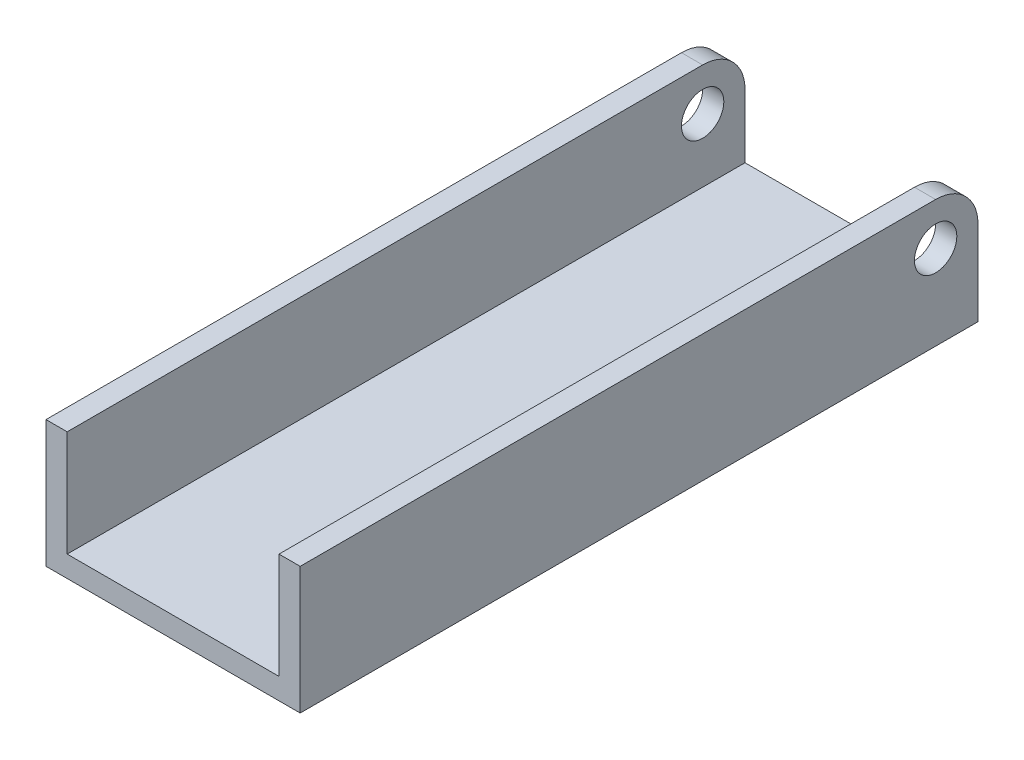
ISO-10303-21;
HEADER;
FILE_DESCRIPTION(('STEP AP214'),'2;1');
FILE_NAME('part.step','',(''),(''),'','','');
FILE_SCHEMA(('AUTOMOTIVE_DESIGN { 1 0 10303 214 1 1 1 1 }'));
ENDSEC;
DATA;
#1=APPLICATION_CONTEXT('core data for automotive mechanical design processes');
#2=APPLICATION_PROTOCOL_DEFINITION('international standard','automotive_design',2000,#1);
#3=PRODUCT_CONTEXT('',#1,'mechanical');
#4=PRODUCT('Part','Part','',(#3));
#5=PRODUCT_RELATED_PRODUCT_CATEGORY('part','',(#4));
#6=PRODUCT_DEFINITION_FORMATION('','',#4);
#7=PRODUCT_DEFINITION_CONTEXT('part definition',#1,'design');
#8=PRODUCT_DEFINITION('design','',#6,#7);
#9=PRODUCT_DEFINITION_SHAPE('','',#8);
#10=(LENGTH_UNIT() NAMED_UNIT(*) SI_UNIT(.MILLI.,.METRE.));
#11=(NAMED_UNIT(*) PLANE_ANGLE_UNIT() SI_UNIT($,.RADIAN.));
#12=(NAMED_UNIT(*) SI_UNIT($,.STERADIAN.) SOLID_ANGLE_UNIT());
#13=UNCERTAINTY_MEASURE_WITH_UNIT(LENGTH_MEASURE(1.E-05),#10,'distance_accuracy_value','');
#14=(GEOMETRIC_REPRESENTATION_CONTEXT(3) GLOBAL_UNCERTAINTY_ASSIGNED_CONTEXT((#13)) GLOBAL_UNIT_ASSIGNED_CONTEXT((#10,
#11,#12)) REPRESENTATION_CONTEXT('',''));
#15=CARTESIAN_POINT('',(0.,0.,0.));
#16=DIRECTION('',(0.,0.,1.));
#17=DIRECTION('',(1.,0.,0.));
#18=AXIS2_PLACEMENT_3D('',#15,#16,#17);
#19=CARTESIAN_POINT('',(0.,0.,50.8));
#20=DIRECTION('',(1.,0.,0.));
#21=DIRECTION('',(0.,0.,-1.));
#22=AXIS2_PLACEMENT_3D('',#19,#20,#21);
#23=PLANE('',#22);
#24=CARTESIAN_POINT('',(0.,6.35,3.175));
#25=DIRECTION('',(1.,0.,0.));
#26=DIRECTION('',(0.,0.,-1.));
#27=AXIS2_PLACEMENT_3D('',#24,#25,#26);
#28=CIRCLE('',#27,1.5875);
#29=CARTESIAN_POINT('',(0.,6.35,1.5875));
#30=VERTEX_POINT('',#29);
#31=EDGE_CURVE('E157',#30,#30,#28,.T.);
#32=ORIENTED_EDGE('',*,*,#31,.T.);
#33=EDGE_LOOP('',(#32));
#34=FACE_BOUND('',#33,.T.);
#35=DIRECTION('',(0.,0.,-1.));
#36=VECTOR('',#35,1.);
#37=CARTESIAN_POINT('',(0.,9.525,50.8));
#38=LINE('',#37,#36);
#39=CARTESIAN_POINT('',(0.,9.525,50.8));
#40=VERTEX_POINT('',#39);
#41=CARTESIAN_POINT('',(0.,9.525,3.175));
#42=VERTEX_POINT('',#41);
#43=EDGE_CURVE('E205',#40,#42,#38,.T.);
#44=ORIENTED_EDGE('',*,*,#43,.T.);
#45=CARTESIAN_POINT('',(0.,6.35,3.175));
#46=DIRECTION('',(1.,0.,0.));
#47=DIRECTION('',(0.,0.,-1.));
#48=AXIS2_PLACEMENT_3D('',#45,#46,#47);
#49=CIRCLE('',#48,3.175);
#50=CARTESIAN_POINT('',(0.,6.35,0.));
#51=VERTEX_POINT('',#50);
#52=EDGE_CURVE('E147',#42,#51,#49,.F.);
#53=ORIENTED_EDGE('',*,*,#52,.T.);
#54=DIRECTION('',(0.,-1.,0.));
#55=VECTOR('',#54,1.);
#56=CARTESIAN_POINT('',(0.,0.,0.));
#57=LINE('',#56,#55);
#58=CARTESIAN_POINT('',(0.,0.,0.));
#59=VERTEX_POINT('',#58);
#60=EDGE_CURVE('E141',#51,#59,#57,.T.);
#61=ORIENTED_EDGE('',*,*,#60,.T.);
#62=DIRECTION('',(0.,0.,-1.));
#63=VECTOR('',#62,1.);
#64=CARTESIAN_POINT('',(0.,0.,50.8));
#65=LINE('',#64,#63);
#66=CARTESIAN_POINT('',(0.,0.,50.8));
#67=VERTEX_POINT('',#66);
#68=EDGE_CURVE('E123',#67,#59,#65,.T.);
#69=ORIENTED_EDGE('',*,*,#68,.F.);
#70=DIRECTION('',(0.,-1.,0.));
#71=VECTOR('',#70,1.);
#72=CARTESIAN_POINT('',(0.,0.,50.8));
#73=LINE('',#72,#71);
#74=EDGE_CURVE('E129',#40,#67,#73,.T.);
#75=ORIENTED_EDGE('',*,*,#74,.F.);
#76=EDGE_LOOP('',(#44,#53,#61,#69,#75));
#77=FACE_BOUND('',#76,.T.);
#78=ADVANCED_FACE('F37',(#34,#77),#23,.F.);
#79=CARTESIAN_POINT('',(0.,0.,50.8));
#80=DIRECTION('',(0.,1.,0.));
#81=DIRECTION('',(-1.,0.,0.));
#82=AXIS2_PLACEMENT_3D('',#79,#80,#81);
#83=PLANE('',#82);
#84=DIRECTION('',(1.,0.,0.));
#85=VECTOR('',#84,1.);
#86=CARTESIAN_POINT('',(0.,0.,0.));
#87=LINE('',#86,#85);
#88=CARTESIAN_POINT('',(19.05,0.,0.));
#89=VERTEX_POINT('',#88);
#90=EDGE_CURVE('E214',#59,#89,#87,.T.);
#91=ORIENTED_EDGE('',*,*,#90,.T.);
#92=DIRECTION('',(0.,0.,-1.));
#93=VECTOR('',#92,1.);
#94=CARTESIAN_POINT('',(19.05,0.,50.8));
#95=LINE('',#94,#93);
#96=CARTESIAN_POINT('',(19.05,0.,50.8));
#97=VERTEX_POINT('',#96);
#98=EDGE_CURVE('E125',#97,#89,#95,.T.);
#99=ORIENTED_EDGE('',*,*,#98,.F.);
#100=DIRECTION('',(1.,0.,0.));
#101=VECTOR('',#100,1.);
#102=CARTESIAN_POINT('',(0.,0.,50.8));
#103=LINE('',#102,#101);
#104=EDGE_CURVE('E119',#67,#97,#103,.T.);
#105=ORIENTED_EDGE('',*,*,#104,.F.);
#106=ORIENTED_EDGE('',*,*,#68,.T.);
#107=EDGE_LOOP('',(#91,#99,#105,#106));
#108=FACE_BOUND('',#107,.T.);
#109=ADVANCED_FACE('F121',(#108),#83,.F.);
#110=CARTESIAN_POINT('',(19.05,9.525,50.8));
#111=DIRECTION('',(-1.,0.,0.));
#112=DIRECTION('',(0.,0.,1.));
#113=AXIS2_PLACEMENT_3D('',#110,#111,#112);
#114=PLANE('',#113);
#115=CARTESIAN_POINT('',(19.05,6.35,3.175));
#116=DIRECTION('',(1.,0.,0.));
#117=DIRECTION('',(0.,0.,-1.));
#118=AXIS2_PLACEMENT_3D('',#115,#116,#117);
#119=CIRCLE('',#118,1.5875);
#120=CARTESIAN_POINT('',(19.05,6.35,1.5875));
#121=VERTEX_POINT('',#120);
#122=EDGE_CURVE('E233',#121,#121,#119,.T.);
#123=ORIENTED_EDGE('',*,*,#122,.F.);
#124=EDGE_LOOP('',(#123));
#125=FACE_BOUND('',#124,.T.);
#126=DIRECTION('',(0.,1.,0.));
#127=VECTOR('',#126,1.);
#128=CARTESIAN_POINT('',(19.05,9.525,0.));
#129=LINE('',#128,#127);
#130=CARTESIAN_POINT('',(19.05,6.35,0.));
#131=VERTEX_POINT('',#130);
#132=EDGE_CURVE('E186',#89,#131,#129,.T.);
#133=ORIENTED_EDGE('',*,*,#132,.T.);
#134=CARTESIAN_POINT('',(19.05,6.35,3.175));
#135=DIRECTION('',(-1.,0.,0.));
#136=DIRECTION('',(0.,0.,1.));
#137=AXIS2_PLACEMENT_3D('',#134,#135,#136);
#138=CIRCLE('',#137,3.175);
#139=CARTESIAN_POINT('',(19.05,9.525,3.175));
#140=VERTEX_POINT('',#139);
#141=EDGE_CURVE('E11',#131,#140,#138,.F.);
#142=ORIENTED_EDGE('',*,*,#141,.T.);
#143=DIRECTION('',(0.,0.,-1.));
#144=VECTOR('',#143,1.);
#145=CARTESIAN_POINT('',(19.05,9.525,50.8));
#146=LINE('',#145,#144);
#147=CARTESIAN_POINT('',(19.05,9.525,50.8));
#148=VERTEX_POINT('',#147);
#149=EDGE_CURVE('E149',#148,#140,#146,.T.);
#150=ORIENTED_EDGE('',*,*,#149,.F.);
#151=DIRECTION('',(0.,1.,0.));
#152=VECTOR('',#151,1.);
#153=CARTESIAN_POINT('',(19.05,9.525,50.8));
#154=LINE('',#153,#152);
#155=EDGE_CURVE('E128',#97,#148,#154,.T.);
#156=ORIENTED_EDGE('',*,*,#155,.F.);
#157=ORIENTED_EDGE('',*,*,#98,.T.);
#158=EDGE_LOOP('',(#133,#142,#150,#156,#157));
#159=FACE_BOUND('',#158,.T.);
#160=ADVANCED_FACE('F240',(#125,#159),#114,.F.);
#161=CARTESIAN_POINT('',(17.4625,9.525,50.8));
#162=DIRECTION('',(0.,-1.,0.));
#163=DIRECTION('',(0.,0.,-1.));
#164=AXIS2_PLACEMENT_3D('',#161,#162,#163);
#165=PLANE('',#164);
#166=ORIENTED_EDGE('',*,*,#149,.T.);
#167=DIRECTION('',(-1.,0.,0.));
#168=VECTOR('',#167,1.);
#169=CARTESIAN_POINT('',(17.4625,9.525,3.175));
#170=LINE('',#169,#168);
#171=CARTESIAN_POINT('',(17.4625,9.525,3.175));
#172=VERTEX_POINT('',#171);
#173=EDGE_CURVE('E169',#140,#172,#170,.T.);
#174=ORIENTED_EDGE('',*,*,#173,.T.);
#175=DIRECTION('',(0.,0.,-1.));
#176=VECTOR('',#175,1.);
#177=CARTESIAN_POINT('',(17.4625,9.525,50.8));
#178=LINE('',#177,#176);
#179=CARTESIAN_POINT('',(17.4625,9.525,50.8));
#180=VERTEX_POINT('',#179);
#181=EDGE_CURVE('E179',#180,#172,#178,.T.);
#182=ORIENTED_EDGE('',*,*,#181,.F.);
#183=DIRECTION('',(-1.,0.,0.));
#184=VECTOR('',#183,1.);
#185=CARTESIAN_POINT('',(17.4625,9.525,50.8));
#186=LINE('',#185,#184);
#187=EDGE_CURVE('E191',#148,#180,#186,.T.);
#188=ORIENTED_EDGE('',*,*,#187,.F.);
#189=EDGE_LOOP('',(#166,#174,#182,#188));
#190=FACE_BOUND('',#189,.T.);
#191=ADVANCED_FACE('F189',(#190),#165,.F.);
#192=CARTESIAN_POINT('',(17.4625,9.525,50.8));
#193=DIRECTION('',(1.,0.,0.));
#194=DIRECTION('',(0.,0.,-1.));
#195=AXIS2_PLACEMENT_3D('',#192,#193,#194);
#196=PLANE('',#195);
#197=CARTESIAN_POINT('',(17.4625,6.35,3.175));
#198=DIRECTION('',(1.,0.,0.));
#199=DIRECTION('',(0.,0.,-1.));
#200=AXIS2_PLACEMENT_3D('',#197,#198,#199);
#201=CIRCLE('',#200,1.5875);
#202=CARTESIAN_POINT('',(17.4625,6.35,1.5875));
#203=VERTEX_POINT('',#202);
#204=EDGE_CURVE('E156',#203,#203,#201,.T.);
#205=ORIENTED_EDGE('',*,*,#204,.T.);
#206=EDGE_LOOP('',(#205));
#207=FACE_BOUND('',#206,.T.);
#208=ORIENTED_EDGE('',*,*,#181,.T.);
#209=CARTESIAN_POINT('',(17.4625,6.35,3.175));
#210=DIRECTION('',(1.,0.,0.));
#211=DIRECTION('',(0.,0.,-1.));
#212=AXIS2_PLACEMENT_3D('',#209,#210,#211);
#213=CIRCLE('',#212,3.175);
#214=CARTESIAN_POINT('',(17.4625,6.35,0.));
#215=VERTEX_POINT('',#214);
#216=EDGE_CURVE('E45',#172,#215,#213,.F.);
#217=ORIENTED_EDGE('',*,*,#216,.T.);
#218=DIRECTION('',(0.,-1.,0.));
#219=VECTOR('',#218,1.);
#220=CARTESIAN_POINT('',(17.4625,9.525,0.));
#221=LINE('',#220,#219);
#222=CARTESIAN_POINT('',(17.4625,1.5875,0.));
#223=VERTEX_POINT('',#222);
#224=EDGE_CURVE('E175',#215,#223,#221,.T.);
#225=ORIENTED_EDGE('',*,*,#224,.T.);
#226=DIRECTION('',(0.,0.,-1.));
#227=VECTOR('',#226,1.);
#228=CARTESIAN_POINT('',(17.4625,1.5875,50.8));
#229=LINE('',#228,#227);
#230=CARTESIAN_POINT('',(17.4625,1.5875,50.8));
#231=VERTEX_POINT('',#230);
#232=EDGE_CURVE('E193',#231,#223,#229,.T.);
#233=ORIENTED_EDGE('',*,*,#232,.F.);
#234=DIRECTION('',(0.,-1.,0.));
#235=VECTOR('',#234,1.);
#236=CARTESIAN_POINT('',(17.4625,9.525,50.8));
#237=LINE('',#236,#235);
#238=EDGE_CURVE('E224',#180,#231,#237,.T.);
#239=ORIENTED_EDGE('',*,*,#238,.F.);
#240=EDGE_LOOP('',(#208,#217,#225,#233,#239));
#241=FACE_BOUND('',#240,.T.);
#242=ADVANCED_FACE('F173',(#207,#241),#196,.F.);
#243=CARTESIAN_POINT('',(17.4625,1.5875,50.8));
#244=DIRECTION('',(0.,-1.,0.));
#245=DIRECTION('',(1.,0.,0.));
#246=AXIS2_PLACEMENT_3D('',#243,#244,#245);
#247=PLANE('',#246);
#248=DIRECTION('',(-1.,0.,0.));
#249=VECTOR('',#248,1.);
#250=CARTESIAN_POINT('',(17.4625,1.5875,0.));
#251=LINE('',#250,#249);
#252=CARTESIAN_POINT('',(1.5875,1.5875,0.));
#253=VERTEX_POINT('',#252);
#254=EDGE_CURVE('E185',#223,#253,#251,.T.);
#255=ORIENTED_EDGE('',*,*,#254,.T.);
#256=DIRECTION('',(0.,0.,-1.));
#257=VECTOR('',#256,1.);
#258=CARTESIAN_POINT('',(1.5875,1.5875,50.8));
#259=LINE('',#258,#257);
#260=CARTESIAN_POINT('',(1.5875,1.5875,50.8));
#261=VERTEX_POINT('',#260);
#262=EDGE_CURVE('E197',#261,#253,#259,.T.);
#263=ORIENTED_EDGE('',*,*,#262,.F.);
#264=DIRECTION('',(-1.,0.,0.));
#265=VECTOR('',#264,1.);
#266=CARTESIAN_POINT('',(17.4625,1.5875,50.8));
#267=LINE('',#266,#265);
#268=EDGE_CURVE('E222',#231,#261,#267,.T.);
#269=ORIENTED_EDGE('',*,*,#268,.F.);
#270=ORIENTED_EDGE('',*,*,#232,.T.);
#271=EDGE_LOOP('',(#255,#263,#269,#270));
#272=FACE_BOUND('',#271,.T.);
#273=ADVANCED_FACE('F261',(#272),#247,.F.);
#274=CARTESIAN_POINT('',(1.5875,1.5875,50.8));
#275=DIRECTION('',(-1.,0.,0.));
#276=DIRECTION('',(0.,-1.,0.));
#277=AXIS2_PLACEMENT_3D('',#274,#275,#276);
#278=PLANE('',#277);
#279=CARTESIAN_POINT('',(1.5875,6.35,3.175));
#280=DIRECTION('',(-1.,0.,0.));
#281=DIRECTION('',(0.,-1.,0.));
#282=AXIS2_PLACEMENT_3D('',#279,#280,#281);
#283=CIRCLE('',#282,1.5875);
#284=CARTESIAN_POINT('',(1.5875,4.7625,3.175));
#285=VERTEX_POINT('',#284);
#286=EDGE_CURVE('E153',#285,#285,#283,.T.);
#287=ORIENTED_EDGE('',*,*,#286,.T.);
#288=EDGE_LOOP('',(#287));
#289=FACE_BOUND('',#288,.T.);
#290=DIRECTION('',(0.,1.,0.));
#291=VECTOR('',#290,1.);
#292=CARTESIAN_POINT('',(1.5875,1.5875,0.));
#293=LINE('',#292,#291);
#294=CARTESIAN_POINT('',(1.5875,6.35,0.));
#295=VERTEX_POINT('',#294);
#296=EDGE_CURVE('E138',#253,#295,#293,.T.);
#297=ORIENTED_EDGE('',*,*,#296,.T.);
#298=CARTESIAN_POINT('',(1.5875,6.35,3.175));
#299=DIRECTION('',(-1.,0.,0.));
#300=DIRECTION('',(0.,-1.,0.));
#301=AXIS2_PLACEMENT_3D('',#298,#299,#300);
#302=CIRCLE('',#301,3.175);
#303=CARTESIAN_POINT('',(1.5875,9.525,3.175));
#304=VERTEX_POINT('',#303);
#305=EDGE_CURVE('E166',#295,#304,#302,.F.);
#306=ORIENTED_EDGE('',*,*,#305,.T.);
#307=DIRECTION('',(0.,0.,-1.));
#308=VECTOR('',#307,1.);
#309=CARTESIAN_POINT('',(1.5875,9.525,50.8));
#310=LINE('',#309,#308);
#311=CARTESIAN_POINT('',(1.5875,9.525,50.8));
#312=VERTEX_POINT('',#311);
#313=EDGE_CURVE('E201',#312,#304,#310,.T.);
#314=ORIENTED_EDGE('',*,*,#313,.F.);
#315=DIRECTION('',(0.,1.,0.));
#316=VECTOR('',#315,1.);
#317=CARTESIAN_POINT('',(1.5875,1.5875,50.8));
#318=LINE('',#317,#316);
#319=EDGE_CURVE('E220',#261,#312,#318,.T.);
#320=ORIENTED_EDGE('',*,*,#319,.F.);
#321=ORIENTED_EDGE('',*,*,#262,.T.);
#322=EDGE_LOOP('',(#297,#306,#314,#320,#321));
#323=FACE_BOUND('',#322,.T.);
#324=ADVANCED_FACE('F250',(#289,#323),#278,.F.);
#325=CARTESIAN_POINT('',(0.,9.525,50.8));
#326=DIRECTION('',(0.,-1.,0.));
#327=DIRECTION('',(0.,0.,-1.));
#328=AXIS2_PLACEMENT_3D('',#325,#326,#327);
#329=PLANE('',#328);
#330=ORIENTED_EDGE('',*,*,#313,.T.);
#331=DIRECTION('',(-1.,0.,0.));
#332=VECTOR('',#331,1.);
#333=CARTESIAN_POINT('',(0.,9.525,3.175));
#334=LINE('',#333,#332);
#335=EDGE_CURVE('E143',#304,#42,#334,.T.);
#336=ORIENTED_EDGE('',*,*,#335,.T.);
#337=ORIENTED_EDGE('',*,*,#43,.F.);
#338=DIRECTION('',(-1.,0.,0.));
#339=VECTOR('',#338,1.);
#340=CARTESIAN_POINT('',(0.,9.525,50.8));
#341=LINE('',#340,#339);
#342=EDGE_CURVE('E134',#312,#40,#341,.T.);
#343=ORIENTED_EDGE('',*,*,#342,.F.);
#344=EDGE_LOOP('',(#330,#336,#337,#343));
#345=FACE_BOUND('',#344,.T.);
#346=ADVANCED_FACE('F253',(#345),#329,.F.);
#347=CARTESIAN_POINT('',(0.,0.,50.8));
#348=DIRECTION('',(0.,0.,-1.));
#349=DIRECTION('',(-1.,0.,0.));
#350=AXIS2_PLACEMENT_3D('',#347,#348,#349);
#351=PLANE('',#350);
#352=ORIENTED_EDGE('',*,*,#74,.T.);
#353=ORIENTED_EDGE('',*,*,#104,.T.);
#354=ORIENTED_EDGE('',*,*,#155,.T.);
#355=ORIENTED_EDGE('',*,*,#187,.T.);
#356=ORIENTED_EDGE('',*,*,#238,.T.);
#357=ORIENTED_EDGE('',*,*,#268,.T.);
#358=ORIENTED_EDGE('',*,*,#319,.T.);
#359=ORIENTED_EDGE('',*,*,#342,.T.);
#360=EDGE_LOOP('',(#352,#353,#354,#355,#356,#357,#358,#359));
#361=FACE_BOUND('',#360,.T.);
#362=ADVANCED_FACE('F132',(#361),#351,.F.);
#363=CARTESIAN_POINT('',(0.,0.,0.));
#364=DIRECTION('',(0.,0.,-1.));
#365=DIRECTION('',(-1.,0.,0.));
#366=AXIS2_PLACEMENT_3D('',#363,#364,#365);
#367=PLANE('',#366);
#368=ORIENTED_EDGE('',*,*,#60,.F.);
#369=DIRECTION('',(-1.,0.,0.));
#370=VECTOR('',#369,1.);
#371=CARTESIAN_POINT('',(1.5875,6.35,0.));
#372=LINE('',#371,#370);
#373=EDGE_CURVE('E163',#51,#295,#372,.F.);
#374=ORIENTED_EDGE('',*,*,#373,.T.);
#375=ORIENTED_EDGE('',*,*,#296,.F.);
#376=ORIENTED_EDGE('',*,*,#254,.F.);
#377=ORIENTED_EDGE('',*,*,#224,.F.);
#378=DIRECTION('',(-1.,0.,0.));
#379=VECTOR('',#378,1.);
#380=CARTESIAN_POINT('',(19.05,6.35,0.));
#381=LINE('',#380,#379);
#382=EDGE_CURVE('E161',#215,#131,#381,.F.);
#383=ORIENTED_EDGE('',*,*,#382,.T.);
#384=ORIENTED_EDGE('',*,*,#132,.F.);
#385=ORIENTED_EDGE('',*,*,#90,.F.);
#386=EDGE_LOOP('',(#368,#374,#375,#376,#377,#383,#384,#385));
#387=FACE_BOUND('',#386,.T.);
#388=ADVANCED_FACE('F182',(#387),#367,.T.);
#389=CARTESIAN_POINT('',(19.05,6.35,3.175));
#390=DIRECTION('',(1.,0.,0.));
#391=DIRECTION('',(0.,0.,-1.));
#392=AXIS2_PLACEMENT_3D('',#389,#390,#391);
#393=CYLINDRICAL_SURFACE('',#392,1.5875);
#394=ORIENTED_EDGE('',*,*,#31,.F.);
#395=EDGE_LOOP('',(#394));
#396=FACE_BOUND('',#395,.T.);
#397=ORIENTED_EDGE('',*,*,#286,.F.);
#398=EDGE_LOOP('',(#397));
#399=FACE_BOUND('',#398,.T.);
#400=ADVANCED_FACE('F277',(#396,#399),#393,.F.);
#401=ORIENTED_EDGE('',*,*,#122,.T.);
#402=EDGE_LOOP('',(#401));
#403=FACE_BOUND('',#402,.T.);
#404=ORIENTED_EDGE('',*,*,#204,.F.);
#405=EDGE_LOOP('',(#404));
#406=FACE_BOUND('',#405,.T.);
#407=ADVANCED_FACE('F237',(#403,#406),#393,.F.);
#408=CARTESIAN_POINT('',(0.,6.35,3.175));
#409=DIRECTION('',(1.,0.,0.));
#410=DIRECTION('',(0.,0.,-1.));
#411=AXIS2_PLACEMENT_3D('',#408,#409,#410);
#412=CYLINDRICAL_SURFACE('',#411,3.175);
#413=ORIENTED_EDGE('',*,*,#305,.F.);
#414=ORIENTED_EDGE('',*,*,#373,.F.);
#415=ORIENTED_EDGE('',*,*,#52,.F.);
#416=ORIENTED_EDGE('',*,*,#335,.F.);
#417=EDGE_LOOP('',(#413,#414,#415,#416));
#418=FACE_BOUND('',#417,.T.);
#419=ADVANCED_FACE('F246',(#418),#412,.T.);
#420=CARTESIAN_POINT('',(17.4625,6.35,3.175));
#421=DIRECTION('',(1.,0.,0.));
#422=DIRECTION('',(0.,0.,-1.));
#423=AXIS2_PLACEMENT_3D('',#420,#421,#422);
#424=CYLINDRICAL_SURFACE('',#423,3.175);
#425=ORIENTED_EDGE('',*,*,#141,.F.);
#426=ORIENTED_EDGE('',*,*,#382,.F.);
#427=ORIENTED_EDGE('',*,*,#216,.F.);
#428=ORIENTED_EDGE('',*,*,#173,.F.);
#429=EDGE_LOOP('',(#425,#426,#427,#428));
#430=FACE_BOUND('',#429,.T.);
#431=ADVANCED_FACE('F39',(#430),#424,.T.);
#432=CLOSED_SHELL('',(#78,#109,#160,#191,#242,#273,#324,#346,#362,#388,#400,#407,#419,#431));
#433=MANIFOLD_SOLID_BREP('B2',#432);
#434=ADVANCED_BREP_SHAPE_REPRESENTATION('',(#18,#433),#14);
#435=SHAPE_DEFINITION_REPRESENTATION(#9,#434);
ENDSEC;
END-ISO-10303-21;
